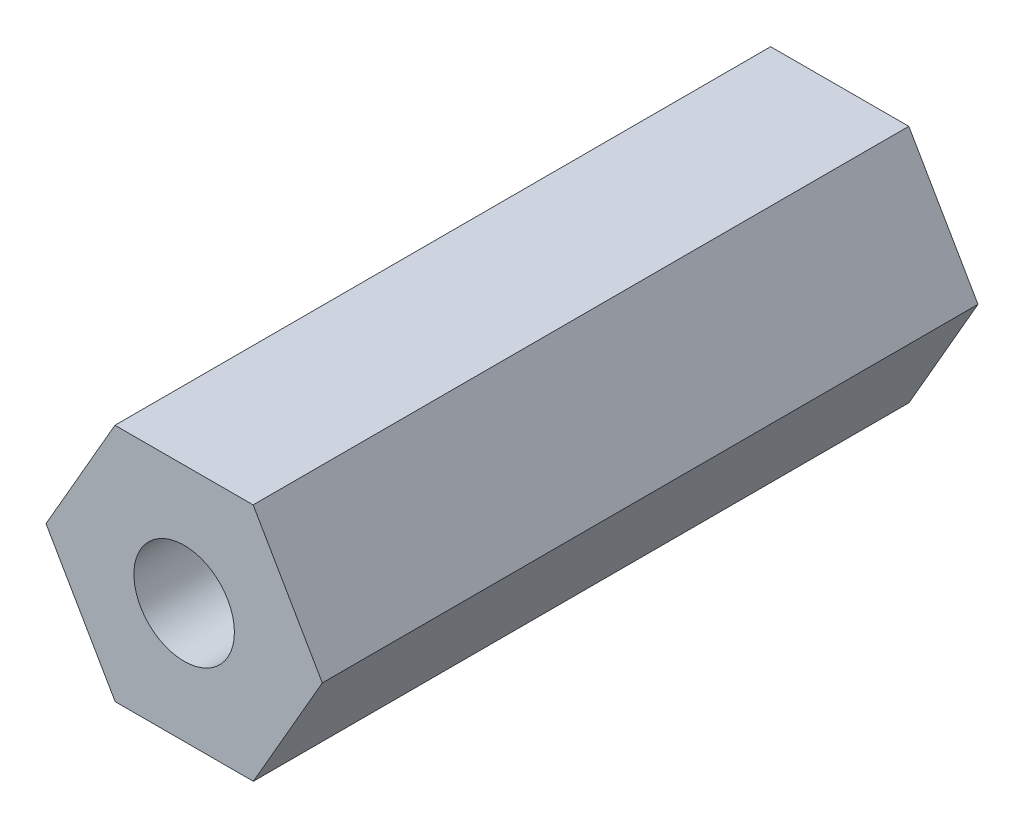
ISO-10303-21;
HEADER;
FILE_DESCRIPTION(('STEP AP214'),'2;1');
FILE_NAME('part.step','',(''),(''),'','','');
FILE_SCHEMA(('AUTOMOTIVE_DESIGN { 1 0 10303 214 1 1 1 1 }'));
ENDSEC;
DATA;
#1=APPLICATION_CONTEXT('core data for automotive mechanical design processes');
#2=APPLICATION_PROTOCOL_DEFINITION('international standard','automotive_design',2000,#1);
#3=PRODUCT_CONTEXT('',#1,'mechanical');
#4=PRODUCT('Part','Part','',(#3));
#5=PRODUCT_RELATED_PRODUCT_CATEGORY('part','',(#4));
#6=PRODUCT_DEFINITION_FORMATION('','',#4);
#7=PRODUCT_DEFINITION_CONTEXT('part definition',#1,'design');
#8=PRODUCT_DEFINITION('design','',#6,#7);
#9=PRODUCT_DEFINITION_SHAPE('','',#8);
#10=(LENGTH_UNIT() NAMED_UNIT(*) SI_UNIT(.MILLI.,.METRE.));
#11=(NAMED_UNIT(*) PLANE_ANGLE_UNIT() SI_UNIT($,.RADIAN.));
#12=(NAMED_UNIT(*) SI_UNIT($,.STERADIAN.) SOLID_ANGLE_UNIT());
#13=UNCERTAINTY_MEASURE_WITH_UNIT(LENGTH_MEASURE(1.E-05),#10,'distance_accuracy_value','');
#14=(GEOMETRIC_REPRESENTATION_CONTEXT(3) GLOBAL_UNCERTAINTY_ASSIGNED_CONTEXT((#13)) GLOBAL_UNIT_ASSIGNED_CONTEXT((#10,
#11,#12)) REPRESENTATION_CONTEXT('',''));
#15=CARTESIAN_POINT('',(0.,0.,0.));
#16=DIRECTION('',(0.,0.,1.));
#17=DIRECTION('',(1.,0.,0.));
#18=AXIS2_PLACEMENT_3D('',#15,#16,#17);
#19=CARTESIAN_POINT('',(0.,0.,34.798));
#20=DIRECTION('',(0.,0.,1.));
#21=DIRECTION('',(1.,0.,0.));
#22=AXIS2_PLACEMENT_3D('',#19,#20,#21);
#23=PLANE('',#22);
#24=DIRECTION('',(0.999999581034955,0.000915385117567264,0.));
#25=VECTOR('',#24,1.);
#26=CARTESIAN_POINT('',(-3.66035997785873,-6.01335465561757,34.798));
#27=LINE('',#26,#25);
#28=CARTESIAN_POINT('',(-3.66035997785873,-6.01335465561757,34.798));
#29=VERTEX_POINT('',#28);
#30=CARTESIAN_POINT('',(3.67198536885184,-6.00664273299827,34.798));
#31=VERTEX_POINT('',#30);
#32=EDGE_CURVE('E152',#29,#31,#27,.T.);
#33=ORIENTED_EDGE('',*,*,#32,.T.);
#34=DIRECTION('',(0.499207043751418,0.866482733508851,0.));
#35=VECTOR('',#34,1.);
#36=CARTESIAN_POINT('',(3.67198536885184,-6.00664273299827,34.798));
#37=LINE('',#36,#35);
#38=CARTESIAN_POINT('',(7.33234534671057,0.346710567883354,34.798));
#39=VERTEX_POINT('',#38);
#40=EDGE_CURVE('E100',#31,#39,#37,.T.);
#41=ORIENTED_EDGE('',*,*,#40,.T.);
#42=DIRECTION('',(-0.500792537283537,0.865567348391283,0.));
#43=VECTOR('',#42,1.);
#44=CARTESIAN_POINT('',(7.33234534671057,0.346710567883354,34.798));
#45=LINE('',#44,#43);
#46=CARTESIAN_POINT('',(3.66035997785873,6.69335194614567,34.798));
#47=VERTEX_POINT('',#46);
#48=EDGE_CURVE('E113',#39,#47,#45,.T.);
#49=ORIENTED_EDGE('',*,*,#48,.T.);
#50=DIRECTION('',(-0.999999581034955,-0.00091538511756691,0.));
#51=VECTOR('',#50,1.);
#52=CARTESIAN_POINT('',(3.66035997785873,6.69335194614567,34.798));
#53=LINE('',#52,#51);
#54=CARTESIAN_POINT('',(-3.67198536885183,6.68664002352637,34.798));
#55=VERTEX_POINT('',#54);
#56=EDGE_CURVE('E107',#47,#55,#53,.T.);
#57=ORIENTED_EDGE('',*,*,#56,.T.);
#58=DIRECTION('',(-0.499207043751418,-0.866482733508851,0.));
#59=VECTOR('',#58,1.);
#60=CARTESIAN_POINT('',(-3.67198536885183,6.68664002352637,34.798));
#61=LINE('',#60,#59);
#62=CARTESIAN_POINT('',(-7.33234534671056,0.33328672264475,34.798));
#63=VERTEX_POINT('',#62);
#64=EDGE_CURVE('E111',#55,#63,#61,.T.);
#65=ORIENTED_EDGE('',*,*,#64,.T.);
#66=DIRECTION('',(0.500792537283537,-0.865567348391284,0.));
#67=VECTOR('',#66,1.);
#68=CARTESIAN_POINT('',(-7.33234534671056,0.33328672264475,34.798));
#69=LINE('',#68,#67);
#70=EDGE_CURVE('E63',#63,#29,#69,.T.);
#71=ORIENTED_EDGE('',*,*,#70,.T.);
#72=EDGE_LOOP('',(#33,#41,#49,#57,#65,#71));
#73=FACE_BOUND('',#72,.T.);
#74=CARTESIAN_POINT('',(0.,0.339998645264051,34.798));
#75=DIRECTION('',(0.,0.,1.));
#76=DIRECTION('',(1.,0.,0.));
#77=AXIS2_PLACEMENT_3D('',#74,#75,#76);
#78=CIRCLE('',#77,2.667);
#79=CARTESIAN_POINT('',(2.667,0.339998645264051,34.798));
#80=VERTEX_POINT('',#79);
#81=EDGE_CURVE('E140',#80,#80,#78,.T.);
#82=ORIENTED_EDGE('',*,*,#81,.F.);
#83=EDGE_LOOP('',(#82));
#84=FACE_BOUND('',#83,.T.);
#85=ADVANCED_FACE('F45',(#73,#84),#23,.T.);
#86=CARTESIAN_POINT('',(0.,0.,0.));
#87=DIRECTION('',(0.,0.,1.));
#88=DIRECTION('',(1.,0.,0.));
#89=AXIS2_PLACEMENT_3D('',#86,#87,#88);
#90=PLANE('',#89);
#91=DIRECTION('',(0.999999581034955,0.000915385117567264,0.));
#92=VECTOR('',#91,1.);
#93=CARTESIAN_POINT('',(-3.66035997785873,-6.01335465561757,0.));
#94=LINE('',#93,#92);
#95=CARTESIAN_POINT('',(-3.66035997785873,-6.01335465561757,0.));
#96=VERTEX_POINT('',#95);
#97=CARTESIAN_POINT('',(3.67198536885184,-6.00664273299827,0.));
#98=VERTEX_POINT('',#97);
#99=EDGE_CURVE('E135',#96,#98,#94,.T.);
#100=ORIENTED_EDGE('',*,*,#99,.F.);
#101=DIRECTION('',(0.500792537283537,-0.865567348391284,0.));
#102=VECTOR('',#101,1.);
#103=CARTESIAN_POINT('',(-7.33234534671056,0.33328672264475,0.));
#104=LINE('',#103,#102);
#105=CARTESIAN_POINT('',(-7.33234534671056,0.33328672264475,0.));
#106=VERTEX_POINT('',#105);
#107=EDGE_CURVE('E92',#106,#96,#104,.T.);
#108=ORIENTED_EDGE('',*,*,#107,.F.);
#109=DIRECTION('',(-0.499207043751418,-0.866482733508851,0.));
#110=VECTOR('',#109,1.);
#111=CARTESIAN_POINT('',(-3.67198536885183,6.68664002352637,0.));
#112=LINE('',#111,#110);
#113=CARTESIAN_POINT('',(-3.67198536885183,6.68664002352637,0.));
#114=VERTEX_POINT('',#113);
#115=EDGE_CURVE('E86',#114,#106,#112,.T.);
#116=ORIENTED_EDGE('',*,*,#115,.F.);
#117=DIRECTION('',(-0.999999581034955,-0.00091538511756691,0.));
#118=VECTOR('',#117,1.);
#119=CARTESIAN_POINT('',(3.66035997785873,6.69335194614567,0.));
#120=LINE('',#119,#118);
#121=CARTESIAN_POINT('',(3.66035997785873,6.69335194614567,0.));
#122=VERTEX_POINT('',#121);
#123=EDGE_CURVE('E122',#122,#114,#120,.T.);
#124=ORIENTED_EDGE('',*,*,#123,.F.);
#125=DIRECTION('',(-0.500792537283537,0.865567348391283,0.));
#126=VECTOR('',#125,1.);
#127=CARTESIAN_POINT('',(7.33234534671057,0.346710567883354,0.));
#128=LINE('',#127,#126);
#129=CARTESIAN_POINT('',(7.33234534671057,0.346710567883354,0.));
#130=VERTEX_POINT('',#129);
#131=EDGE_CURVE('E143',#130,#122,#128,.T.);
#132=ORIENTED_EDGE('',*,*,#131,.F.);
#133=DIRECTION('',(0.499207043751418,0.866482733508851,0.));
#134=VECTOR('',#133,1.);
#135=CARTESIAN_POINT('',(3.67198536885184,-6.00664273299827,0.));
#136=LINE('',#135,#134);
#137=EDGE_CURVE('E139',#98,#130,#136,.T.);
#138=ORIENTED_EDGE('',*,*,#137,.F.);
#139=EDGE_LOOP('',(#100,#108,#116,#124,#132,#138));
#140=FACE_BOUND('',#139,.T.);
#141=CARTESIAN_POINT('',(0.,0.339998645264051,0.));
#142=DIRECTION('',(0.,0.,1.));
#143=DIRECTION('',(1.,0.,0.));
#144=AXIS2_PLACEMENT_3D('',#141,#142,#143);
#145=CIRCLE('',#144,2.667);
#146=CARTESIAN_POINT('',(2.667,0.339998645264051,0.));
#147=VERTEX_POINT('',#146);
#148=EDGE_CURVE('E249',#147,#147,#145,.T.);
#149=ORIENTED_EDGE('',*,*,#148,.T.);
#150=EDGE_LOOP('',(#149));
#151=FACE_BOUND('',#150,.T.);
#152=ADVANCED_FACE('F165',(#140,#151),#90,.F.);
#153=CARTESIAN_POINT('',(-3.66035997785873,-6.01335465561757,34.798));
#154=DIRECTION('',(-0.000915385117567264,0.999999581034955,0.));
#155=DIRECTION('',(-0.999999581034956,-0.000915385117567265,0.));
#156=AXIS2_PLACEMENT_3D('',#153,#154,#155);
#157=PLANE('',#156);
#158=ORIENTED_EDGE('',*,*,#99,.T.);
#159=DIRECTION('',(0.,0.,-1.));
#160=VECTOR('',#159,1.);
#161=CARTESIAN_POINT('',(3.67198536885184,-6.00664273299827,34.798));
#162=LINE('',#161,#160);
#163=EDGE_CURVE('E11',#31,#98,#162,.T.);
#164=ORIENTED_EDGE('',*,*,#163,.F.);
#165=ORIENTED_EDGE('',*,*,#32,.F.);
#166=DIRECTION('',(0.,0.,-1.));
#167=VECTOR('',#166,1.);
#168=CARTESIAN_POINT('',(-3.66035997785873,-6.01335465561757,34.798));
#169=LINE('',#168,#167);
#170=EDGE_CURVE('E131',#29,#96,#169,.T.);
#171=ORIENTED_EDGE('',*,*,#170,.T.);
#172=EDGE_LOOP('',(#158,#164,#165,#171));
#173=FACE_BOUND('',#172,.T.);
#174=ADVANCED_FACE('F47',(#173),#157,.F.);
#175=CARTESIAN_POINT('',(3.67198536885184,-6.00664273299827,34.798));
#176=DIRECTION('',(-0.86648273350885,0.499207043751418,0.));
#177=DIRECTION('',(-0.499207043751418,-0.86648273350885,0.));
#178=AXIS2_PLACEMENT_3D('',#175,#176,#177);
#179=PLANE('',#178);
#180=ORIENTED_EDGE('',*,*,#137,.T.);
#181=DIRECTION('',(0.,0.,-1.));
#182=VECTOR('',#181,1.);
#183=CARTESIAN_POINT('',(7.33234534671057,0.346710567883354,34.798));
#184=LINE('',#183,#182);
#185=EDGE_CURVE('E55',#39,#130,#184,.T.);
#186=ORIENTED_EDGE('',*,*,#185,.F.);
#187=ORIENTED_EDGE('',*,*,#40,.F.);
#188=ORIENTED_EDGE('',*,*,#163,.T.);
#189=EDGE_LOOP('',(#180,#186,#187,#188));
#190=FACE_BOUND('',#189,.T.);
#191=ADVANCED_FACE('F190',(#190),#179,.F.);
#192=CARTESIAN_POINT('',(7.33234534671057,0.346710567883354,34.798));
#193=DIRECTION('',(-0.865567348391283,-0.500792537283537,0.));
#194=DIRECTION('',(0.500792537283537,-0.865567348391283,0.));
#195=AXIS2_PLACEMENT_3D('',#192,#193,#194);
#196=PLANE('',#195);
#197=ORIENTED_EDGE('',*,*,#131,.T.);
#198=DIRECTION('',(0.,0.,-1.));
#199=VECTOR('',#198,1.);
#200=CARTESIAN_POINT('',(3.66035997785873,6.69335194614567,34.798));
#201=LINE('',#200,#199);
#202=EDGE_CURVE('E124',#47,#122,#201,.T.);
#203=ORIENTED_EDGE('',*,*,#202,.F.);
#204=ORIENTED_EDGE('',*,*,#48,.F.);
#205=ORIENTED_EDGE('',*,*,#185,.T.);
#206=EDGE_LOOP('',(#197,#203,#204,#205));
#207=FACE_BOUND('',#206,.T.);
#208=ADVANCED_FACE('F162',(#207),#196,.F.);
#209=CARTESIAN_POINT('',(3.66035997785873,6.69335194614567,34.798));
#210=DIRECTION('',(0.00091538511756691,-0.999999581034955,0.));
#211=DIRECTION('',(0.999999581034956,0.00091538511756691,0.));
#212=AXIS2_PLACEMENT_3D('',#209,#210,#211);
#213=PLANE('',#212);
#214=ORIENTED_EDGE('',*,*,#123,.T.);
#215=DIRECTION('',(0.,0.,-1.));
#216=VECTOR('',#215,1.);
#217=CARTESIAN_POINT('',(-3.67198536885183,6.68664002352637,34.798));
#218=LINE('',#217,#216);
#219=EDGE_CURVE('E119',#55,#114,#218,.T.);
#220=ORIENTED_EDGE('',*,*,#219,.F.);
#221=ORIENTED_EDGE('',*,*,#56,.F.);
#222=ORIENTED_EDGE('',*,*,#202,.T.);
#223=EDGE_LOOP('',(#214,#220,#221,#222));
#224=FACE_BOUND('',#223,.T.);
#225=ADVANCED_FACE('F120',(#224),#213,.F.);
#226=CARTESIAN_POINT('',(-3.67198536885183,6.68664002352637,34.798));
#227=DIRECTION('',(0.866482733508851,-0.499207043751418,0.));
#228=DIRECTION('',(0.499207043751418,0.866482733508851,0.));
#229=AXIS2_PLACEMENT_3D('',#226,#227,#228);
#230=PLANE('',#229);
#231=ORIENTED_EDGE('',*,*,#115,.T.);
#232=DIRECTION('',(0.,0.,-1.));
#233=VECTOR('',#232,1.);
#234=CARTESIAN_POINT('',(-7.33234534671056,0.33328672264475,34.798));
#235=LINE('',#234,#233);
#236=EDGE_CURVE('E125',#63,#106,#235,.T.);
#237=ORIENTED_EDGE('',*,*,#236,.F.);
#238=ORIENTED_EDGE('',*,*,#64,.F.);
#239=ORIENTED_EDGE('',*,*,#219,.T.);
#240=EDGE_LOOP('',(#231,#237,#238,#239));
#241=FACE_BOUND('',#240,.T.);
#242=ADVANCED_FACE('F127',(#241),#230,.F.);
#243=CARTESIAN_POINT('',(-7.33234534671056,0.33328672264475,34.798));
#244=DIRECTION('',(0.865567348391283,0.500792537283537,0.));
#245=DIRECTION('',(-0.500792537283537,0.865567348391283,0.));
#246=AXIS2_PLACEMENT_3D('',#243,#244,#245);
#247=PLANE('',#246);
#248=ORIENTED_EDGE('',*,*,#107,.T.);
#249=ORIENTED_EDGE('',*,*,#170,.F.);
#250=ORIENTED_EDGE('',*,*,#70,.F.);
#251=ORIENTED_EDGE('',*,*,#236,.T.);
#252=EDGE_LOOP('',(#248,#249,#250,#251));
#253=FACE_BOUND('',#252,.T.);
#254=ADVANCED_FACE('F170',(#253),#247,.F.);
#255=CARTESIAN_POINT('',(0.,0.339998645264051,34.798));
#256=DIRECTION('',(0.,0.,-1.));
#257=DIRECTION('',(-1.,0.,0.));
#258=AXIS2_PLACEMENT_3D('',#255,#256,#257);
#259=CYLINDRICAL_SURFACE('',#258,2.667);
#260=ORIENTED_EDGE('',*,*,#81,.T.);
#261=EDGE_LOOP('',(#260));
#262=FACE_BOUND('',#261,.T.);
#263=ORIENTED_EDGE('',*,*,#148,.F.);
#264=EDGE_LOOP('',(#263));
#265=FACE_BOUND('',#264,.T.);
#266=ADVANCED_FACE('F172',(#262,#265),#259,.F.);
#267=CLOSED_SHELL('',(#85,#152,#174,#191,#208,#225,#242,#254,#266));
#268=MANIFOLD_SOLID_BREP('B2',#267);
#269=ADVANCED_BREP_SHAPE_REPRESENTATION('',(#18,#268),#14);
#270=SHAPE_DEFINITION_REPRESENTATION(#9,#269);
ENDSEC;
END-ISO-10303-21;
